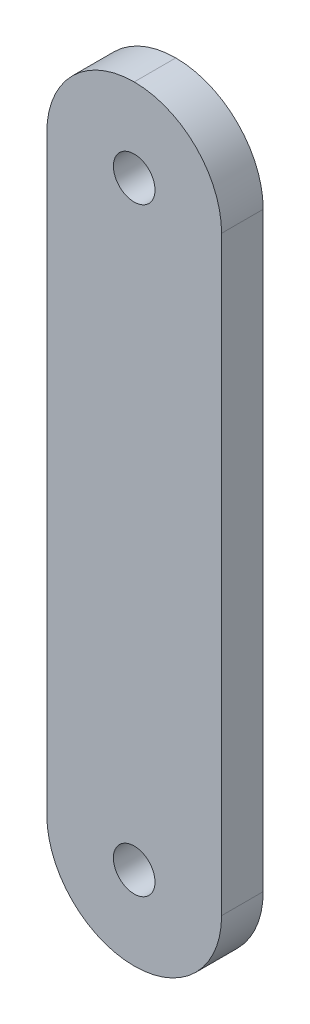
ISO-10303-21;
HEADER;
FILE_DESCRIPTION(('STEP AP214'),'2;1');
FILE_NAME('part.step','',(''),(''),'','','');
FILE_SCHEMA(('AUTOMOTIVE_DESIGN { 1 0 10303 214 1 1 1 1 }'));
ENDSEC;
DATA;
#1=APPLICATION_CONTEXT('core data for automotive mechanical design processes');
#2=APPLICATION_PROTOCOL_DEFINITION('international standard','automotive_design',2000,#1);
#3=PRODUCT_CONTEXT('',#1,'mechanical');
#4=PRODUCT('Part','Part','',(#3));
#5=PRODUCT_RELATED_PRODUCT_CATEGORY('part','',(#4));
#6=PRODUCT_DEFINITION_FORMATION('','',#4);
#7=PRODUCT_DEFINITION_CONTEXT('part definition',#1,'design');
#8=PRODUCT_DEFINITION('design','',#6,#7);
#9=PRODUCT_DEFINITION_SHAPE('','',#8);
#10=(LENGTH_UNIT() NAMED_UNIT(*) SI_UNIT(.MILLI.,.METRE.));
#11=(NAMED_UNIT(*) PLANE_ANGLE_UNIT() SI_UNIT($,.RADIAN.));
#12=(NAMED_UNIT(*) SI_UNIT($,.STERADIAN.) SOLID_ANGLE_UNIT());
#13=UNCERTAINTY_MEASURE_WITH_UNIT(LENGTH_MEASURE(1.E-05),#10,'distance_accuracy_value','');
#14=(GEOMETRIC_REPRESENTATION_CONTEXT(3) GLOBAL_UNCERTAINTY_ASSIGNED_CONTEXT((#13)) GLOBAL_UNIT_ASSIGNED_CONTEXT((#10,
#11,#12)) REPRESENTATION_CONTEXT('',''));
#15=CARTESIAN_POINT('',(0.,0.,0.));
#16=DIRECTION('',(0.,0.,1.));
#17=DIRECTION('',(1.,0.,0.));
#18=AXIS2_PLACEMENT_3D('',#15,#16,#17);
#19=CARTESIAN_POINT('',(-59.6571428571429,37.1142857142857,5.));
#20=DIRECTION('',(1.,0.,0.));
#21=DIRECTION('',(0.,1.,0.));
#22=AXIS2_PLACEMENT_3D('',#19,#20,#21);
#23=PLANE('',#22);
#24=DIRECTION('',(0.,-1.,0.));
#25=VECTOR('',#24,1.);
#26=CARTESIAN_POINT('',(-59.6571428571429,37.1142857142857,0.));
#27=LINE('',#26,#25);
#28=CARTESIAN_POINT('',(-59.6571428571429,26.6142857142857,0.));
#29=VERTEX_POINT('',#28);
#30=CARTESIAN_POINT('',(-59.6571428571428,-44.3857142857143,0.));
#31=VERTEX_POINT('',#30);
#32=EDGE_CURVE('E119',#29,#31,#27,.T.);
#33=ORIENTED_EDGE('',*,*,#32,.T.);
#34=DIRECTION('',(0.,0.,-1.));
#35=VECTOR('',#34,1.);
#36=CARTESIAN_POINT('',(-59.6571428571428,-44.3857142857143,5.));
#37=LINE('',#36,#35);
#38=CARTESIAN_POINT('',(-59.6571428571428,-44.3857142857143,5.));
#39=VERTEX_POINT('',#38);
#40=EDGE_CURVE('E11',#31,#39,#37,.F.);
#41=ORIENTED_EDGE('',*,*,#40,.T.);
#42=DIRECTION('',(0.,-1.,0.));
#43=VECTOR('',#42,1.);
#44=CARTESIAN_POINT('',(-59.6571428571429,37.1142857142857,5.));
#45=LINE('',#44,#43);
#46=CARTESIAN_POINT('',(-59.6571428571429,26.6142857142857,5.));
#47=VERTEX_POINT('',#46);
#48=EDGE_CURVE('E118',#47,#39,#45,.T.);
#49=ORIENTED_EDGE('',*,*,#48,.F.);
#50=DIRECTION('',(0.,0.,-1.));
#51=VECTOR('',#50,1.);
#52=CARTESIAN_POINT('',(-59.6571428571429,26.6142857142857,5.));
#53=LINE('',#52,#51);
#54=EDGE_CURVE('E47',#47,#29,#53,.T.);
#55=ORIENTED_EDGE('',*,*,#54,.T.);
#56=EDGE_LOOP('',(#33,#41,#49,#55));
#57=FACE_BOUND('',#56,.T.);
#58=ADVANCED_FACE('F38',(#57),#23,.F.);
#59=CARTESIAN_POINT('',(-38.6571428571429,37.1142857142857,5.));
#60=DIRECTION('',(-1.,0.,0.));
#61=DIRECTION('',(0.,-1.,0.));
#62=AXIS2_PLACEMENT_3D('',#59,#60,#61);
#63=PLANE('',#62);
#64=DIRECTION('',(0.,1.,0.));
#65=VECTOR('',#64,1.);
#66=CARTESIAN_POINT('',(-38.6571428571429,37.1142857142857,5.));
#67=LINE('',#66,#65);
#68=CARTESIAN_POINT('',(-38.6571428571428,-44.3857142857143,5.));
#69=VERTEX_POINT('',#68);
#70=CARTESIAN_POINT('',(-38.6571428571429,26.6142857142857,5.));
#71=VERTEX_POINT('',#70);
#72=EDGE_CURVE('E111',#69,#71,#67,.T.);
#73=ORIENTED_EDGE('',*,*,#72,.F.);
#74=DIRECTION('',(0.,0.,-1.));
#75=VECTOR('',#74,1.);
#76=CARTESIAN_POINT('',(-38.6571428571428,-44.3857142857143,5.));
#77=LINE('',#76,#75);
#78=CARTESIAN_POINT('',(-38.6571428571428,-44.3857142857143,0.));
#79=VERTEX_POINT('',#78);
#80=EDGE_CURVE('E96',#69,#79,#77,.T.);
#81=ORIENTED_EDGE('',*,*,#80,.T.);
#82=DIRECTION('',(0.,1.,0.));
#83=VECTOR('',#82,1.);
#84=CARTESIAN_POINT('',(-38.6571428571429,37.1142857142857,0.));
#85=LINE('',#84,#83);
#86=CARTESIAN_POINT('',(-38.6571428571429,26.6142857142857,0.));
#87=VERTEX_POINT('',#86);
#88=EDGE_CURVE('E109',#79,#87,#85,.T.);
#89=ORIENTED_EDGE('',*,*,#88,.T.);
#90=DIRECTION('',(0.,0.,-1.));
#91=VECTOR('',#90,1.);
#92=CARTESIAN_POINT('',(-38.6571428571429,26.6142857142857,5.));
#93=LINE('',#92,#91);
#94=EDGE_CURVE('E113',#87,#71,#93,.F.);
#95=ORIENTED_EDGE('',*,*,#94,.T.);
#96=EDGE_LOOP('',(#73,#81,#89,#95));
#97=FACE_BOUND('',#96,.T.);
#98=ADVANCED_FACE('F107',(#97),#63,.F.);
#99=CARTESIAN_POINT('',(0.,0.,5.));
#100=DIRECTION('',(0.,0.,1.));
#101=DIRECTION('',(1.,0.,0.));
#102=AXIS2_PLACEMENT_3D('',#99,#100,#101);
#103=PLANE('',#102);
#104=CARTESIAN_POINT('',(-49.1571428571428,27.1142857142857,5.));
#105=DIRECTION('',(0.,0.,1.));
#106=DIRECTION('',(1.,0.,0.));
#107=AXIS2_PLACEMENT_3D('',#104,#105,#106);
#108=CIRCLE('',#107,2.5);
#109=CARTESIAN_POINT('',(-46.6571428571428,27.1142857142857,5.));
#110=VERTEX_POINT('',#109);
#111=EDGE_CURVE('E133',#110,#110,#108,.T.);
#112=ORIENTED_EDGE('',*,*,#111,.F.);
#113=EDGE_LOOP('',(#112));
#114=FACE_BOUND('',#113,.T.);
#115=CARTESIAN_POINT('',(-49.1571428571428,-44.8857142857143,5.));
#116=DIRECTION('',(0.,0.,1.));
#117=DIRECTION('',(1.,0.,0.));
#118=AXIS2_PLACEMENT_3D('',#115,#116,#117);
#119=CIRCLE('',#118,2.5);
#120=CARTESIAN_POINT('',(-46.6571428571428,-44.8857142857143,5.));
#121=VERTEX_POINT('',#120);
#122=EDGE_CURVE('E129',#121,#121,#119,.T.);
#123=ORIENTED_EDGE('',*,*,#122,.F.);
#124=EDGE_LOOP('',(#123));
#125=FACE_BOUND('',#124,.T.);
#126=CARTESIAN_POINT('',(-49.1571428571428,-44.3857142857143,5.));
#127=DIRECTION('',(0.,0.,1.));
#128=DIRECTION('',(1.,0.,0.));
#129=AXIS2_PLACEMENT_3D('',#126,#127,#128);
#130=CIRCLE('',#129,10.5);
#131=CARTESIAN_POINT('',(-49.1571428571428,-54.8857142857143,5.));
#132=VERTEX_POINT('',#131);
#133=EDGE_CURVE('E62',#39,#132,#130,.T.);
#134=ORIENTED_EDGE('',*,*,#133,.T.);
#135=CARTESIAN_POINT('',(-49.1571428571428,-44.3857142857143,5.));
#136=DIRECTION('',(0.,0.,1.));
#137=DIRECTION('',(1.,0.,0.));
#138=AXIS2_PLACEMENT_3D('',#135,#136,#137);
#139=CIRCLE('',#138,10.5);
#140=EDGE_CURVE('E141',#132,#69,#139,.T.);
#141=ORIENTED_EDGE('',*,*,#140,.T.);
#142=ORIENTED_EDGE('',*,*,#72,.T.);
#143=CARTESIAN_POINT('',(-49.1571428571429,26.6142857142857,5.));
#144=DIRECTION('',(0.,0.,1.));
#145=DIRECTION('',(1.,0.,0.));
#146=AXIS2_PLACEMENT_3D('',#143,#144,#145);
#147=CIRCLE('',#146,10.5);
#148=CARTESIAN_POINT('',(-49.1571428571429,37.1142857142857,5.));
#149=VERTEX_POINT('',#148);
#150=EDGE_CURVE('E55',#71,#149,#147,.T.);
#151=ORIENTED_EDGE('',*,*,#150,.T.);
#152=CARTESIAN_POINT('',(-49.1571428571429,26.6142857142857,5.));
#153=DIRECTION('',(0.,0.,1.));
#154=DIRECTION('',(1.,0.,0.));
#155=AXIS2_PLACEMENT_3D('',#152,#153,#154);
#156=CIRCLE('',#155,10.5);
#157=EDGE_CURVE('E101',#149,#47,#156,.T.);
#158=ORIENTED_EDGE('',*,*,#157,.T.);
#159=ORIENTED_EDGE('',*,*,#48,.T.);
#160=EDGE_LOOP('',(#134,#141,#142,#151,#158,#159));
#161=FACE_BOUND('',#160,.T.);
#162=ADVANCED_FACE('F153',(#114,#125,#161),#103,.T.);
#163=CARTESIAN_POINT('',(0.,0.,0.));
#164=DIRECTION('',(0.,0.,1.));
#165=DIRECTION('',(1.,0.,0.));
#166=AXIS2_PLACEMENT_3D('',#163,#164,#165);
#167=PLANE('',#166);
#168=CARTESIAN_POINT('',(-49.1571428571428,27.1142857142857,0.));
#169=DIRECTION('',(0.,0.,1.));
#170=DIRECTION('',(1.,0.,0.));
#171=AXIS2_PLACEMENT_3D('',#168,#169,#170);
#172=CIRCLE('',#171,2.5);
#173=CARTESIAN_POINT('',(-46.6571428571428,27.1142857142857,0.));
#174=VERTEX_POINT('',#173);
#175=EDGE_CURVE('E130',#174,#174,#172,.T.);
#176=ORIENTED_EDGE('',*,*,#175,.T.);
#177=EDGE_LOOP('',(#176));
#178=FACE_BOUND('',#177,.T.);
#179=CARTESIAN_POINT('',(-49.1571428571428,-44.8857142857143,0.));
#180=DIRECTION('',(0.,0.,1.));
#181=DIRECTION('',(1.,0.,0.));
#182=AXIS2_PLACEMENT_3D('',#179,#180,#181);
#183=CIRCLE('',#182,2.5);
#184=CARTESIAN_POINT('',(-46.6571428571428,-44.8857142857143,0.));
#185=VERTEX_POINT('',#184);
#186=EDGE_CURVE('E123',#185,#185,#183,.T.);
#187=ORIENTED_EDGE('',*,*,#186,.T.);
#188=EDGE_LOOP('',(#187));
#189=FACE_BOUND('',#188,.T.);
#190=ORIENTED_EDGE('',*,*,#88,.F.);
#191=CARTESIAN_POINT('',(-49.1571428571428,-44.3857142857143,0.));
#192=DIRECTION('',(0.,0.,1.));
#193=DIRECTION('',(1.,0.,0.));
#194=AXIS2_PLACEMENT_3D('',#191,#192,#193);
#195=CIRCLE('',#194,10.5);
#196=CARTESIAN_POINT('',(-49.1571428571428,-54.8857142857143,0.));
#197=VERTEX_POINT('',#196);
#198=EDGE_CURVE('E92',#79,#197,#195,.F.);
#199=ORIENTED_EDGE('',*,*,#198,.T.);
#200=CARTESIAN_POINT('',(-49.1571428571428,-44.3857142857143,0.));
#201=DIRECTION('',(0.,0.,1.));
#202=DIRECTION('',(1.,0.,0.));
#203=AXIS2_PLACEMENT_3D('',#200,#201,#202);
#204=CIRCLE('',#203,10.5);
#205=EDGE_CURVE('E102',#197,#31,#204,.F.);
#206=ORIENTED_EDGE('',*,*,#205,.T.);
#207=ORIENTED_EDGE('',*,*,#32,.F.);
#208=CARTESIAN_POINT('',(-49.1571428571429,26.6142857142857,0.));
#209=DIRECTION('',(0.,0.,1.));
#210=DIRECTION('',(1.,0.,0.));
#211=AXIS2_PLACEMENT_3D('',#208,#209,#210);
#212=CIRCLE('',#211,10.5);
#213=CARTESIAN_POINT('',(-49.1571428571429,37.1142857142857,0.));
#214=VERTEX_POINT('',#213);
#215=EDGE_CURVE('E112',#29,#214,#212,.F.);
#216=ORIENTED_EDGE('',*,*,#215,.T.);
#217=CARTESIAN_POINT('',(-49.1571428571429,26.6142857142857,0.));
#218=DIRECTION('',(0.,0.,1.));
#219=DIRECTION('',(1.,0.,0.));
#220=AXIS2_PLACEMENT_3D('',#217,#218,#219);
#221=CIRCLE('',#220,10.5);
#222=EDGE_CURVE('E117',#214,#87,#221,.F.);
#223=ORIENTED_EDGE('',*,*,#222,.T.);
#224=EDGE_LOOP('',(#190,#199,#206,#207,#216,#223));
#225=FACE_BOUND('',#224,.T.);
#226=ADVANCED_FACE('F115',(#178,#189,#225),#167,.F.);
#227=CARTESIAN_POINT('',(-49.1571428571428,-44.8857142857143,-10.));
#228=DIRECTION('',(0.,0.,1.));
#229=DIRECTION('',(1.,0.,0.));
#230=AXIS2_PLACEMENT_3D('',#227,#228,#229);
#231=CYLINDRICAL_SURFACE('',#230,2.5);
#232=ORIENTED_EDGE('',*,*,#122,.T.);
#233=EDGE_LOOP('',(#232));
#234=FACE_BOUND('',#233,.T.);
#235=ORIENTED_EDGE('',*,*,#186,.F.);
#236=EDGE_LOOP('',(#235));
#237=FACE_BOUND('',#236,.T.);
#238=ADVANCED_FACE('F163',(#234,#237),#231,.F.);
#239=CARTESIAN_POINT('',(-49.1571428571428,27.1142857142857,-10.));
#240=DIRECTION('',(0.,0.,1.));
#241=DIRECTION('',(1.,0.,0.));
#242=AXIS2_PLACEMENT_3D('',#239,#240,#241);
#243=CYLINDRICAL_SURFACE('',#242,2.5);
#244=ORIENTED_EDGE('',*,*,#111,.T.);
#245=EDGE_LOOP('',(#244));
#246=FACE_BOUND('',#245,.T.);
#247=ORIENTED_EDGE('',*,*,#175,.F.);
#248=EDGE_LOOP('',(#247));
#249=FACE_BOUND('',#248,.T.);
#250=ADVANCED_FACE('F187',(#246,#249),#243,.F.);
#251=CARTESIAN_POINT('',(-49.1571428571428,-44.3857142857143,5.));
#252=DIRECTION('',(0.,0.,-1.));
#253=DIRECTION('',(-1.,0.,0.));
#254=AXIS2_PLACEMENT_3D('',#251,#252,#253);
#255=CYLINDRICAL_SURFACE('',#254,10.5);
#256=DIRECTION('',(0.,0.,-1.));
#257=VECTOR('',#256,1.);
#258=CARTESIAN_POINT('',(-49.1571428571428,-54.8857142857143,5.));
#259=LINE('',#258,#257);
#260=EDGE_CURVE('E97',#132,#197,#259,.T.);
#261=ORIENTED_EDGE('',*,*,#260,.F.);
#262=ORIENTED_EDGE('',*,*,#133,.F.);
#263=ORIENTED_EDGE('',*,*,#40,.F.);
#264=ORIENTED_EDGE('',*,*,#205,.F.);
#265=EDGE_LOOP('',(#261,#262,#263,#264));
#266=FACE_BOUND('',#265,.T.);
#267=ADVANCED_FACE('F158',(#266),#255,.T.);
#268=CARTESIAN_POINT('',(-49.1571428571428,-44.3857142857143,5.));
#269=DIRECTION('',(0.,0.,-1.));
#270=DIRECTION('',(-1.,0.,0.));
#271=AXIS2_PLACEMENT_3D('',#268,#269,#270);
#272=CYLINDRICAL_SURFACE('',#271,10.5);
#273=ORIENTED_EDGE('',*,*,#140,.F.);
#274=ORIENTED_EDGE('',*,*,#260,.T.);
#275=ORIENTED_EDGE('',*,*,#198,.F.);
#276=ORIENTED_EDGE('',*,*,#80,.F.);
#277=EDGE_LOOP('',(#273,#274,#275,#276));
#278=FACE_BOUND('',#277,.T.);
#279=ADVANCED_FACE('F95',(#278),#272,.T.);
#280=CARTESIAN_POINT('',(-49.1571428571429,26.6142857142857,5.));
#281=DIRECTION('',(0.,0.,-1.));
#282=DIRECTION('',(-1.,0.,0.));
#283=AXIS2_PLACEMENT_3D('',#280,#281,#282);
#284=CYLINDRICAL_SURFACE('',#283,10.5);
#285=ORIENTED_EDGE('',*,*,#54,.F.);
#286=ORIENTED_EDGE('',*,*,#157,.F.);
#287=DIRECTION('',(0.,0.,-1.));
#288=VECTOR('',#287,1.);
#289=CARTESIAN_POINT('',(-49.1571428571429,37.1142857142857,5.));
#290=LINE('',#289,#288);
#291=EDGE_CURVE('E42',#214,#149,#290,.F.);
#292=ORIENTED_EDGE('',*,*,#291,.F.);
#293=ORIENTED_EDGE('',*,*,#215,.F.);
#294=EDGE_LOOP('',(#285,#286,#292,#293));
#295=FACE_BOUND('',#294,.T.);
#296=ADVANCED_FACE('F40',(#295),#284,.T.);
#297=CARTESIAN_POINT('',(-49.1571428571429,26.6142857142857,5.));
#298=DIRECTION('',(0.,0.,-1.));
#299=DIRECTION('',(-1.,0.,0.));
#300=AXIS2_PLACEMENT_3D('',#297,#298,#299);
#301=CYLINDRICAL_SURFACE('',#300,10.5);
#302=ORIENTED_EDGE('',*,*,#150,.F.);
#303=ORIENTED_EDGE('',*,*,#94,.F.);
#304=ORIENTED_EDGE('',*,*,#222,.F.);
#305=ORIENTED_EDGE('',*,*,#291,.T.);
#306=EDGE_LOOP('',(#302,#303,#304,#305));
#307=FACE_BOUND('',#306,.T.);
#308=ADVANCED_FACE('F148',(#307),#301,.T.);
#309=CLOSED_SHELL('',(#58,#98,#162,#226,#238,#250,#267,#279,#296,#308));
#310=MANIFOLD_SOLID_BREP('B2',#309);
#311=ADVANCED_BREP_SHAPE_REPRESENTATION('',(#18,#310),#14);
#312=SHAPE_DEFINITION_REPRESENTATION(#9,#311);
ENDSEC;
END-ISO-10303-21;
